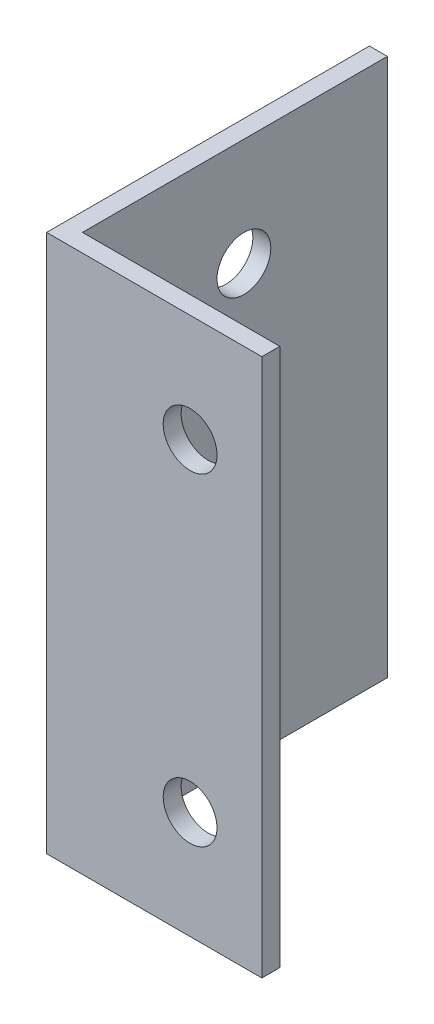
ISO-10303-21;
HEADER;
FILE_DESCRIPTION(('STEP AP214'),'2;1');
FILE_NAME('part.step','',(''),(''),'','','');
FILE_SCHEMA(('AUTOMOTIVE_DESIGN { 1 0 10303 214 1 1 1 1 }'));
ENDSEC;
DATA;
#1=APPLICATION_CONTEXT('core data for automotive mechanical design processes');
#2=APPLICATION_PROTOCOL_DEFINITION('international standard','automotive_design',2000,#1);
#3=PRODUCT_CONTEXT('',#1,'mechanical');
#4=PRODUCT('Part','Part','',(#3));
#5=PRODUCT_RELATED_PRODUCT_CATEGORY('part','',(#4));
#6=PRODUCT_DEFINITION_FORMATION('','',#4);
#7=PRODUCT_DEFINITION_CONTEXT('part definition',#1,'design');
#8=PRODUCT_DEFINITION('design','',#6,#7);
#9=PRODUCT_DEFINITION_SHAPE('','',#8);
#10=(LENGTH_UNIT() NAMED_UNIT(*) SI_UNIT(.MILLI.,.METRE.));
#11=(NAMED_UNIT(*) PLANE_ANGLE_UNIT() SI_UNIT($,.RADIAN.));
#12=(NAMED_UNIT(*) SI_UNIT($,.STERADIAN.) SOLID_ANGLE_UNIT());
#13=UNCERTAINTY_MEASURE_WITH_UNIT(LENGTH_MEASURE(1.E-05),#10,'distance_accuracy_value','');
#14=(GEOMETRIC_REPRESENTATION_CONTEXT(3) GLOBAL_UNCERTAINTY_ASSIGNED_CONTEXT((#13)) GLOBAL_UNIT_ASSIGNED_CONTEXT((#10,
#11,#12)) REPRESENTATION_CONTEXT('',''));
#15=CARTESIAN_POINT('',(0.,0.,0.));
#16=DIRECTION('',(0.,0.,1.));
#17=DIRECTION('',(1.,0.,0.));
#18=AXIS2_PLACEMENT_3D('',#15,#16,#17);
#19=CARTESIAN_POINT('',(12.,30.,0.));
#20=DIRECTION('',(0.,0.,-1.));
#21=DIRECTION('',(-1.,0.,0.));
#22=AXIS2_PLACEMENT_3D('',#19,#20,#21);
#23=PLANE('',#22);
#24=CARTESIAN_POINT('',(8.,6.,0.));
#25=DIRECTION('',(0.,0.,-1.));
#26=DIRECTION('',(-1.,0.,0.));
#27=AXIS2_PLACEMENT_3D('',#24,#25,#26);
#28=CIRCLE('',#27,1.5);
#29=CARTESIAN_POINT('',(6.5,6.,0.));
#30=VERTEX_POINT('',#29);
#31=EDGE_CURVE('E132',#30,#30,#28,.T.);
#32=ORIENTED_EDGE('',*,*,#31,.T.);
#33=EDGE_LOOP('',(#32));
#34=FACE_BOUND('',#33,.T.);
#35=CARTESIAN_POINT('',(8.,24.,0.));
#36=DIRECTION('',(0.,0.,-1.));
#37=DIRECTION('',(1.,0.,0.));
#38=AXIS2_PLACEMENT_3D('',#35,#36,#37);
#39=CIRCLE('',#38,1.5);
#40=CARTESIAN_POINT('',(9.5,24.,0.));
#41=VERTEX_POINT('',#40);
#42=EDGE_CURVE('E185',#41,#41,#39,.T.);
#43=ORIENTED_EDGE('',*,*,#42,.T.);
#44=EDGE_LOOP('',(#43));
#45=FACE_BOUND('',#44,.T.);
#46=DIRECTION('',(1.,0.,0.));
#47=VECTOR('',#46,1.);
#48=CARTESIAN_POINT('',(12.,0.,0.));
#49=LINE('',#48,#47);
#50=CARTESIAN_POINT('',(0.,0.,0.));
#51=VERTEX_POINT('',#50);
#52=CARTESIAN_POINT('',(12.,0.,0.));
#53=VERTEX_POINT('',#52);
#54=EDGE_CURVE('E127',#51,#53,#49,.T.);
#55=ORIENTED_EDGE('',*,*,#54,.T.);
#56=DIRECTION('',(0.,-1.,0.));
#57=VECTOR('',#56,1.);
#58=CARTESIAN_POINT('',(12.,30.,0.));
#59=LINE('',#58,#57);
#60=CARTESIAN_POINT('',(12.,30.,0.));
#61=VERTEX_POINT('',#60);
#62=EDGE_CURVE('E11',#61,#53,#59,.T.);
#63=ORIENTED_EDGE('',*,*,#62,.F.);
#64=DIRECTION('',(1.,0.,0.));
#65=VECTOR('',#64,1.);
#66=CARTESIAN_POINT('',(12.,30.,0.));
#67=LINE('',#66,#65);
#68=CARTESIAN_POINT('',(0.,30.,0.));
#69=VERTEX_POINT('',#68);
#70=EDGE_CURVE('E144',#69,#61,#67,.T.);
#71=ORIENTED_EDGE('',*,*,#70,.F.);
#72=DIRECTION('',(0.,-1.,0.));
#73=VECTOR('',#72,1.);
#74=CARTESIAN_POINT('',(0.,30.,0.));
#75=LINE('',#74,#73);
#76=EDGE_CURVE('E123',#69,#51,#75,.T.);
#77=ORIENTED_EDGE('',*,*,#76,.T.);
#78=EDGE_LOOP('',(#55,#63,#71,#77));
#79=FACE_BOUND('',#78,.T.);
#80=ADVANCED_FACE('F38',(#34,#45,#79),#23,.F.);
#81=CARTESIAN_POINT('',(12.,30.,-1.));
#82=DIRECTION('',(-1.,0.,0.));
#83=DIRECTION('',(0.,0.,1.));
#84=AXIS2_PLACEMENT_3D('',#81,#82,#83);
#85=PLANE('',#84);
#86=DIRECTION('',(0.,0.,-1.));
#87=VECTOR('',#86,1.);
#88=CARTESIAN_POINT('',(12.,0.,-1.));
#89=LINE('',#88,#87);
#90=CARTESIAN_POINT('',(12.,0.,-1.));
#91=VERTEX_POINT('',#90);
#92=EDGE_CURVE('E131',#53,#91,#89,.T.);
#93=ORIENTED_EDGE('',*,*,#92,.T.);
#94=DIRECTION('',(0.,-1.,0.));
#95=VECTOR('',#94,1.);
#96=CARTESIAN_POINT('',(12.,30.,-1.));
#97=LINE('',#96,#95);
#98=CARTESIAN_POINT('',(12.,30.,-1.));
#99=VERTEX_POINT('',#98);
#100=EDGE_CURVE('E47',#99,#91,#97,.T.);
#101=ORIENTED_EDGE('',*,*,#100,.F.);
#102=DIRECTION('',(0.,0.,-1.));
#103=VECTOR('',#102,1.);
#104=CARTESIAN_POINT('',(12.,30.,-1.));
#105=LINE('',#104,#103);
#106=EDGE_CURVE('E92',#61,#99,#105,.T.);
#107=ORIENTED_EDGE('',*,*,#106,.F.);
#108=ORIENTED_EDGE('',*,*,#62,.T.);
#109=EDGE_LOOP('',(#93,#101,#107,#108));
#110=FACE_BOUND('',#109,.T.);
#111=ADVANCED_FACE('F175',(#110),#85,.F.);
#112=CARTESIAN_POINT('',(1.,30.,-1.));
#113=DIRECTION('',(0.,0.,1.));
#114=DIRECTION('',(1.,0.,0.));
#115=AXIS2_PLACEMENT_3D('',#112,#113,#114);
#116=PLANE('',#115);
#117=CARTESIAN_POINT('',(8.,6.,-1.));
#118=DIRECTION('',(0.,0.,-1.));
#119=DIRECTION('',(-1.,0.,0.));
#120=AXIS2_PLACEMENT_3D('',#117,#118,#119);
#121=CIRCLE('',#120,1.5);
#122=CARTESIAN_POINT('',(6.5,6.,-1.));
#123=VERTEX_POINT('',#122);
#124=EDGE_CURVE('E188',#123,#123,#121,.T.);
#125=ORIENTED_EDGE('',*,*,#124,.F.);
#126=EDGE_LOOP('',(#125));
#127=FACE_BOUND('',#126,.T.);
#128=CARTESIAN_POINT('',(8.,24.,-1.));
#129=DIRECTION('',(0.,0.,-1.));
#130=DIRECTION('',(1.,0.,0.));
#131=AXIS2_PLACEMENT_3D('',#128,#129,#130);
#132=CIRCLE('',#131,1.5);
#133=CARTESIAN_POINT('',(9.5,24.,-1.));
#134=VERTEX_POINT('',#133);
#135=EDGE_CURVE('E189',#134,#134,#132,.T.);
#136=ORIENTED_EDGE('',*,*,#135,.F.);
#137=EDGE_LOOP('',(#136));
#138=FACE_BOUND('',#137,.T.);
#139=DIRECTION('',(-1.,0.,0.));
#140=VECTOR('',#139,1.);
#141=CARTESIAN_POINT('',(1.,0.,-1.));
#142=LINE('',#141,#140);
#143=CARTESIAN_POINT('',(1.,0.,-1.));
#144=VERTEX_POINT('',#143);
#145=EDGE_CURVE('E135',#91,#144,#142,.T.);
#146=ORIENTED_EDGE('',*,*,#145,.T.);
#147=DIRECTION('',(0.,-1.,0.));
#148=VECTOR('',#147,1.);
#149=CARTESIAN_POINT('',(1.,30.,-1.));
#150=LINE('',#149,#148);
#151=CARTESIAN_POINT('',(1.,30.,-1.));
#152=VERTEX_POINT('',#151);
#153=EDGE_CURVE('E116',#152,#144,#150,.T.);
#154=ORIENTED_EDGE('',*,*,#153,.F.);
#155=DIRECTION('',(-1.,0.,0.));
#156=VECTOR('',#155,1.);
#157=CARTESIAN_POINT('',(1.,30.,-1.));
#158=LINE('',#157,#156);
#159=EDGE_CURVE('E105',#99,#152,#158,.T.);
#160=ORIENTED_EDGE('',*,*,#159,.F.);
#161=ORIENTED_EDGE('',*,*,#100,.T.);
#162=EDGE_LOOP('',(#146,#154,#160,#161));
#163=FACE_BOUND('',#162,.T.);
#164=ADVANCED_FACE('F154',(#127,#138,#163),#116,.F.);
#165=CARTESIAN_POINT('',(1.,30.,-18.));
#166=DIRECTION('',(-1.,0.,0.));
#167=DIRECTION('',(0.,0.,1.));
#168=AXIS2_PLACEMENT_3D('',#165,#166,#167);
#169=PLANE('',#168);
#170=CARTESIAN_POINT('',(1.,24.,-9.99999999999999));
#171=DIRECTION('',(1.,0.,0.));
#172=DIRECTION('',(0.,0.,-1.));
#173=AXIS2_PLACEMENT_3D('',#170,#171,#172);
#174=CIRCLE('',#173,1.5);
#175=CARTESIAN_POINT('',(1.,24.,-11.5));
#176=VERTEX_POINT('',#175);
#177=EDGE_CURVE('E214',#176,#176,#174,.T.);
#178=ORIENTED_EDGE('',*,*,#177,.F.);
#179=EDGE_LOOP('',(#178));
#180=FACE_BOUND('',#179,.T.);
#181=CARTESIAN_POINT('',(1.,6.,-9.99999999999999));
#182=DIRECTION('',(1.,0.,0.));
#183=DIRECTION('',(0.,0.,1.));
#184=AXIS2_PLACEMENT_3D('',#181,#182,#183);
#185=CIRCLE('',#184,1.5);
#186=CARTESIAN_POINT('',(1.,6.,-8.49999999999999));
#187=VERTEX_POINT('',#186);
#188=EDGE_CURVE('E206',#187,#187,#185,.T.);
#189=ORIENTED_EDGE('',*,*,#188,.F.);
#190=EDGE_LOOP('',(#189));
#191=FACE_BOUND('',#190,.T.);
#192=DIRECTION('',(0.,0.,-1.));
#193=VECTOR('',#192,1.);
#194=CARTESIAN_POINT('',(1.,0.,-18.));
#195=LINE('',#194,#193);
#196=CARTESIAN_POINT('',(1.,0.,-18.));
#197=VERTEX_POINT('',#196);
#198=EDGE_CURVE('E114',#144,#197,#195,.T.);
#199=ORIENTED_EDGE('',*,*,#198,.T.);
#200=DIRECTION('',(0.,-1.,0.));
#201=VECTOR('',#200,1.);
#202=CARTESIAN_POINT('',(1.,30.,-18.));
#203=LINE('',#202,#201);
#204=CARTESIAN_POINT('',(1.,30.,-18.));
#205=VERTEX_POINT('',#204);
#206=EDGE_CURVE('E111',#205,#197,#203,.T.);
#207=ORIENTED_EDGE('',*,*,#206,.F.);
#208=DIRECTION('',(0.,0.,-1.));
#209=VECTOR('',#208,1.);
#210=CARTESIAN_POINT('',(1.,30.,-18.));
#211=LINE('',#210,#209);
#212=EDGE_CURVE('E99',#152,#205,#211,.T.);
#213=ORIENTED_EDGE('',*,*,#212,.F.);
#214=ORIENTED_EDGE('',*,*,#153,.T.);
#215=EDGE_LOOP('',(#199,#207,#213,#214));
#216=FACE_BOUND('',#215,.T.);
#217=ADVANCED_FACE('F112',(#180,#191,#216),#169,.F.);
#218=CARTESIAN_POINT('',(0.,30.,-18.));
#219=DIRECTION('',(0.,0.,1.));
#220=DIRECTION('',(1.,0.,0.));
#221=AXIS2_PLACEMENT_3D('',#218,#219,#220);
#222=PLANE('',#221);
#223=DIRECTION('',(-1.,0.,0.));
#224=VECTOR('',#223,1.);
#225=CARTESIAN_POINT('',(0.,0.,-18.));
#226=LINE('',#225,#224);
#227=CARTESIAN_POINT('',(0.,0.,-18.));
#228=VERTEX_POINT('',#227);
#229=EDGE_CURVE('E78',#197,#228,#226,.T.);
#230=ORIENTED_EDGE('',*,*,#229,.T.);
#231=DIRECTION('',(0.,-1.,0.));
#232=VECTOR('',#231,1.);
#233=CARTESIAN_POINT('',(0.,30.,-18.));
#234=LINE('',#233,#232);
#235=CARTESIAN_POINT('',(0.,30.,-18.));
#236=VERTEX_POINT('',#235);
#237=EDGE_CURVE('E117',#236,#228,#234,.T.);
#238=ORIENTED_EDGE('',*,*,#237,.F.);
#239=DIRECTION('',(-1.,0.,0.));
#240=VECTOR('',#239,1.);
#241=CARTESIAN_POINT('',(0.,30.,-18.));
#242=LINE('',#241,#240);
#243=EDGE_CURVE('E103',#205,#236,#242,.T.);
#244=ORIENTED_EDGE('',*,*,#243,.F.);
#245=ORIENTED_EDGE('',*,*,#206,.T.);
#246=EDGE_LOOP('',(#230,#238,#244,#245));
#247=FACE_BOUND('',#246,.T.);
#248=ADVANCED_FACE('F119',(#247),#222,.F.);
#249=CARTESIAN_POINT('',(0.,30.,0.));
#250=DIRECTION('',(1.,0.,0.));
#251=DIRECTION('',(0.,0.,-1.));
#252=AXIS2_PLACEMENT_3D('',#249,#250,#251);
#253=PLANE('',#252);
#254=CARTESIAN_POINT('',(0.,24.,-9.99999999999999));
#255=DIRECTION('',(1.,0.,0.));
#256=DIRECTION('',(0.,0.,-1.));
#257=AXIS2_PLACEMENT_3D('',#254,#255,#256);
#258=CIRCLE('',#257,1.5);
#259=CARTESIAN_POINT('',(0.,24.,-11.5));
#260=VERTEX_POINT('',#259);
#261=EDGE_CURVE('E196',#260,#260,#258,.T.);
#262=ORIENTED_EDGE('',*,*,#261,.T.);
#263=EDGE_LOOP('',(#262));
#264=FACE_BOUND('',#263,.T.);
#265=CARTESIAN_POINT('',(0.,6.,-9.99999999999999));
#266=DIRECTION('',(1.,0.,0.));
#267=DIRECTION('',(0.,0.,1.));
#268=AXIS2_PLACEMENT_3D('',#265,#266,#267);
#269=CIRCLE('',#268,1.5);
#270=CARTESIAN_POINT('',(0.,6.,-8.49999999999999));
#271=VERTEX_POINT('',#270);
#272=EDGE_CURVE('E210',#271,#271,#269,.T.);
#273=ORIENTED_EDGE('',*,*,#272,.T.);
#274=EDGE_LOOP('',(#273));
#275=FACE_BOUND('',#274,.T.);
#276=DIRECTION('',(0.,0.,1.));
#277=VECTOR('',#276,1.);
#278=CARTESIAN_POINT('',(0.,0.,0.));
#279=LINE('',#278,#277);
#280=EDGE_CURVE('E84',#228,#51,#279,.T.);
#281=ORIENTED_EDGE('',*,*,#280,.T.);
#282=ORIENTED_EDGE('',*,*,#76,.F.);
#283=DIRECTION('',(0.,0.,1.));
#284=VECTOR('',#283,1.);
#285=CARTESIAN_POINT('',(0.,30.,0.));
#286=LINE('',#285,#284);
#287=EDGE_CURVE('E55',#236,#69,#286,.T.);
#288=ORIENTED_EDGE('',*,*,#287,.F.);
#289=ORIENTED_EDGE('',*,*,#237,.T.);
#290=EDGE_LOOP('',(#281,#282,#288,#289));
#291=FACE_BOUND('',#290,.T.);
#292=ADVANCED_FACE('F161',(#264,#275,#291),#253,.F.);
#293=CARTESIAN_POINT('',(0.,30.,0.));
#294=DIRECTION('',(0.,-1.,0.));
#295=DIRECTION('',(0.,0.,-1.));
#296=AXIS2_PLACEMENT_3D('',#293,#294,#295);
#297=PLANE('',#296);
#298=ORIENTED_EDGE('',*,*,#70,.T.);
#299=ORIENTED_EDGE('',*,*,#106,.T.);
#300=ORIENTED_EDGE('',*,*,#159,.T.);
#301=ORIENTED_EDGE('',*,*,#212,.T.);
#302=ORIENTED_EDGE('',*,*,#243,.T.);
#303=ORIENTED_EDGE('',*,*,#287,.T.);
#304=EDGE_LOOP('',(#298,#299,#300,#301,#302,#303));
#305=FACE_BOUND('',#304,.T.);
#306=ADVANCED_FACE('F101',(#305),#297,.F.);
#307=CARTESIAN_POINT('',(0.,0.,0.));
#308=DIRECTION('',(0.,-1.,0.));
#309=DIRECTION('',(0.,0.,-1.));
#310=AXIS2_PLACEMENT_3D('',#307,#308,#309);
#311=PLANE('',#310);
#312=ORIENTED_EDGE('',*,*,#54,.F.);
#313=ORIENTED_EDGE('',*,*,#280,.F.);
#314=ORIENTED_EDGE('',*,*,#229,.F.);
#315=ORIENTED_EDGE('',*,*,#198,.F.);
#316=ORIENTED_EDGE('',*,*,#145,.F.);
#317=ORIENTED_EDGE('',*,*,#92,.F.);
#318=EDGE_LOOP('',(#312,#313,#314,#315,#316,#317));
#319=FACE_BOUND('',#318,.T.);
#320=ADVANCED_FACE('F157',(#319),#311,.T.);
#321=CARTESIAN_POINT('',(8.,24.,0.));
#322=DIRECTION('',(0.,0.,-1.));
#323=DIRECTION('',(-1.,0.,0.));
#324=AXIS2_PLACEMENT_3D('',#321,#322,#323);
#325=CYLINDRICAL_SURFACE('',#324,1.5);
#326=ORIENTED_EDGE('',*,*,#42,.F.);
#327=EDGE_LOOP('',(#326));
#328=FACE_BOUND('',#327,.T.);
#329=ORIENTED_EDGE('',*,*,#135,.T.);
#330=EDGE_LOOP('',(#329));
#331=FACE_BOUND('',#330,.T.);
#332=ADVANCED_FACE('F240',(#328,#331),#325,.F.);
#333=CARTESIAN_POINT('',(8.,6.,0.));
#334=DIRECTION('',(0.,0.,-1.));
#335=DIRECTION('',(-1.,0.,0.));
#336=AXIS2_PLACEMENT_3D('',#333,#334,#335);
#337=CYLINDRICAL_SURFACE('',#336,1.5);
#338=ORIENTED_EDGE('',*,*,#31,.F.);
#339=EDGE_LOOP('',(#338));
#340=FACE_BOUND('',#339,.T.);
#341=ORIENTED_EDGE('',*,*,#124,.T.);
#342=EDGE_LOOP('',(#341));
#343=FACE_BOUND('',#342,.T.);
#344=ADVANCED_FACE('F234',(#340,#343),#337,.F.);
#345=CARTESIAN_POINT('',(0.,6.,-9.99999999999999));
#346=DIRECTION('',(1.,0.,0.));
#347=DIRECTION('',(0.,0.,-1.));
#348=AXIS2_PLACEMENT_3D('',#345,#346,#347);
#349=CYLINDRICAL_SURFACE('',#348,1.5);
#350=ORIENTED_EDGE('',*,*,#272,.F.);
#351=EDGE_LOOP('',(#350));
#352=FACE_BOUND('',#351,.T.);
#353=ORIENTED_EDGE('',*,*,#188,.T.);
#354=EDGE_LOOP('',(#353));
#355=FACE_BOUND('',#354,.T.);
#356=ADVANCED_FACE('F224',(#352,#355),#349,.F.);
#357=CARTESIAN_POINT('',(0.,24.,-9.99999999999999));
#358=DIRECTION('',(1.,0.,0.));
#359=DIRECTION('',(0.,0.,-1.));
#360=AXIS2_PLACEMENT_3D('',#357,#358,#359);
#361=CYLINDRICAL_SURFACE('',#360,1.5);
#362=ORIENTED_EDGE('',*,*,#261,.F.);
#363=EDGE_LOOP('',(#362));
#364=FACE_BOUND('',#363,.T.);
#365=ORIENTED_EDGE('',*,*,#177,.T.);
#366=EDGE_LOOP('',(#365));
#367=FACE_BOUND('',#366,.T.);
#368=ADVANCED_FACE('F221',(#364,#367),#361,.F.);
#369=CLOSED_SHELL('',(#80,#111,#164,#217,#248,#292,#306,#320,#332,#344,#356,#368));
#370=MANIFOLD_SOLID_BREP('B2',#369);
#371=ADVANCED_BREP_SHAPE_REPRESENTATION('',(#18,#370),#14);
#372=SHAPE_DEFINITION_REPRESENTATION(#9,#371);
ENDSEC;
END-ISO-10303-21;
